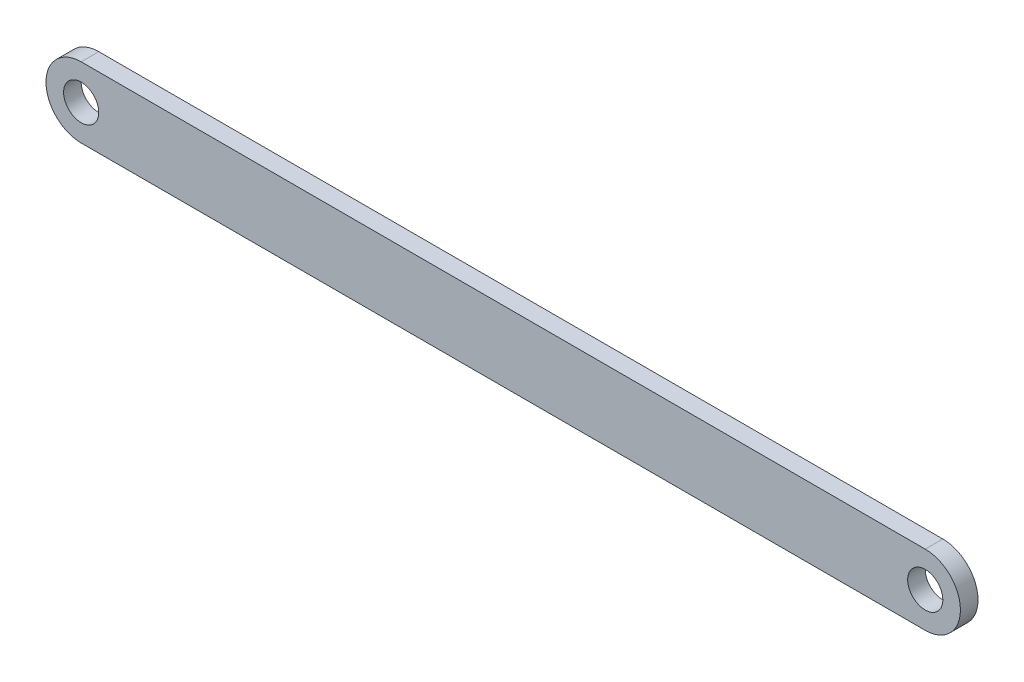
ISO-10303-21;
HEADER;
FILE_DESCRIPTION(('STEP AP214'),'2;1');
FILE_NAME('part.step','',(''),(''),'','','');
FILE_SCHEMA(('AUTOMOTIVE_DESIGN { 1 0 10303 214 1 1 1 1 }'));
ENDSEC;
DATA;
#1=APPLICATION_CONTEXT('core data for automotive mechanical design processes');
#2=APPLICATION_PROTOCOL_DEFINITION('international standard','automotive_design',2000,#1);
#3=PRODUCT_CONTEXT('',#1,'mechanical');
#4=PRODUCT('Part','Part','',(#3));
#5=PRODUCT_RELATED_PRODUCT_CATEGORY('part','',(#4));
#6=PRODUCT_DEFINITION_FORMATION('','',#4);
#7=PRODUCT_DEFINITION_CONTEXT('part definition',#1,'design');
#8=PRODUCT_DEFINITION('design','',#6,#7);
#9=PRODUCT_DEFINITION_SHAPE('','',#8);
#10=(LENGTH_UNIT() NAMED_UNIT(*) SI_UNIT(.MILLI.,.METRE.));
#11=(NAMED_UNIT(*) PLANE_ANGLE_UNIT() SI_UNIT($,.RADIAN.));
#12=(NAMED_UNIT(*) SI_UNIT($,.STERADIAN.) SOLID_ANGLE_UNIT());
#13=UNCERTAINTY_MEASURE_WITH_UNIT(LENGTH_MEASURE(1.E-05),#10,'distance_accuracy_value','');
#14=(GEOMETRIC_REPRESENTATION_CONTEXT(3) GLOBAL_UNCERTAINTY_ASSIGNED_CONTEXT((#13)) GLOBAL_UNIT_ASSIGNED_CONTEXT((#10,
#11,#12)) REPRESENTATION_CONTEXT('',''));
#15=CARTESIAN_POINT('',(0.,0.,0.));
#16=DIRECTION('',(0.,0.,1.));
#17=DIRECTION('',(1.,0.,0.));
#18=AXIS2_PLACEMENT_3D('',#15,#16,#17);
#19=CARTESIAN_POINT('',(-762.,0.157439451623581,15.875));
#20=DIRECTION('',(0.,0.,1.));
#21=DIRECTION('',(1.,0.,0.));
#22=AXIS2_PLACEMENT_3D('',#19,#20,#21);
#23=PLANE('',#22);
#24=CARTESIAN_POINT('',(-762.,0.157439451623581,15.875));
#25=DIRECTION('',(0.,0.,1.));
#26=DIRECTION('',(1.,0.,0.));
#27=AXIS2_PLACEMENT_3D('',#24,#25,#26);
#28=CIRCLE('',#27,31.75);
#29=CARTESIAN_POINT('',(-730.25,0.157439451623581,15.875));
#30=VERTEX_POINT('',#29);
#31=EDGE_CURVE('E104',#30,#30,#28,.T.);
#32=ORIENTED_EDGE('',*,*,#31,.F.);
#33=EDGE_LOOP('',(#32));
#34=FACE_BOUND('',#33,.T.);
#35=CARTESIAN_POINT('',(-762.,0.157439451623581,15.875));
#36=DIRECTION('',(0.,0.,1.));
#37=DIRECTION('',(1.,0.,0.));
#38=AXIS2_PLACEMENT_3D('',#35,#36,#37);
#39=CIRCLE('',#38,63.5);
#40=CARTESIAN_POINT('',(-762.,63.6574394516236,15.875));
#41=VERTEX_POINT('',#40);
#42=CARTESIAN_POINT('',(-762.,-63.3425605483764,15.875));
#43=VERTEX_POINT('',#42);
#44=EDGE_CURVE('E89',#41,#43,#39,.T.);
#45=ORIENTED_EDGE('',*,*,#44,.T.);
#46=DIRECTION('',(1.,0.,0.));
#47=VECTOR('',#46,1.);
#48=CARTESIAN_POINT('',(-762.,-63.3425605483764,15.875));
#49=LINE('',#48,#47);
#50=CARTESIAN_POINT('',(762.,-63.3425605483764,15.875));
#51=VERTEX_POINT('',#50);
#52=EDGE_CURVE('E84',#43,#51,#49,.T.);
#53=ORIENTED_EDGE('',*,*,#52,.T.);
#54=CARTESIAN_POINT('',(762.,0.157439451623581,15.875));
#55=DIRECTION('',(0.,0.,1.));
#56=DIRECTION('',(1.,0.,0.));
#57=AXIS2_PLACEMENT_3D('',#54,#55,#56);
#58=CIRCLE('',#57,63.5);
#59=CARTESIAN_POINT('',(762.,63.6574394516236,15.875));
#60=VERTEX_POINT('',#59);
#61=EDGE_CURVE('E87',#51,#60,#58,.T.);
#62=ORIENTED_EDGE('',*,*,#61,.T.);
#63=DIRECTION('',(-1.,0.,0.));
#64=VECTOR('',#63,1.);
#65=CARTESIAN_POINT('',(-762.,63.6574394516236,15.875));
#66=LINE('',#65,#64);
#67=EDGE_CURVE('E54',#60,#41,#66,.T.);
#68=ORIENTED_EDGE('',*,*,#67,.T.);
#69=EDGE_LOOP('',(#45,#53,#62,#68));
#70=FACE_BOUND('',#69,.T.);
#71=CARTESIAN_POINT('',(762.,0.157439451623581,15.875));
#72=DIRECTION('',(0.,0.,1.));
#73=DIRECTION('',(1.,0.,0.));
#74=AXIS2_PLACEMENT_3D('',#71,#72,#73);
#75=CIRCLE('',#74,31.75);
#76=CARTESIAN_POINT('',(793.75,0.157439451623581,15.875));
#77=VERTEX_POINT('',#76);
#78=EDGE_CURVE('E119',#77,#77,#75,.T.);
#79=ORIENTED_EDGE('',*,*,#78,.F.);
#80=EDGE_LOOP('',(#79));
#81=FACE_BOUND('',#80,.T.);
#82=ADVANCED_FACE('F37',(#34,#70,#81),#23,.T.);
#83=CARTESIAN_POINT('',(-762.,0.157439451623581,-15.875));
#84=DIRECTION('',(0.,0.,1.));
#85=DIRECTION('',(1.,0.,0.));
#86=AXIS2_PLACEMENT_3D('',#83,#84,#85);
#87=PLANE('',#86);
#88=CARTESIAN_POINT('',(-762.,0.157439451623581,-15.875));
#89=DIRECTION('',(0.,0.,1.));
#90=DIRECTION('',(1.,0.,0.));
#91=AXIS2_PLACEMENT_3D('',#88,#89,#90);
#92=CIRCLE('',#91,31.75);
#93=CARTESIAN_POINT('',(-730.25,0.157439451623581,-15.875));
#94=VERTEX_POINT('',#93);
#95=EDGE_CURVE('E116',#94,#94,#92,.T.);
#96=ORIENTED_EDGE('',*,*,#95,.T.);
#97=EDGE_LOOP('',(#96));
#98=FACE_BOUND('',#97,.T.);
#99=CARTESIAN_POINT('',(-762.,0.157439451623581,-15.875));
#100=DIRECTION('',(0.,0.,1.));
#101=DIRECTION('',(1.,0.,0.));
#102=AXIS2_PLACEMENT_3D('',#99,#100,#101);
#103=CIRCLE('',#102,63.5);
#104=CARTESIAN_POINT('',(-762.,63.6574394516236,-15.875));
#105=VERTEX_POINT('',#104);
#106=CARTESIAN_POINT('',(-762.,-63.3425605483764,-15.875));
#107=VERTEX_POINT('',#106);
#108=EDGE_CURVE('E101',#105,#107,#103,.T.);
#109=ORIENTED_EDGE('',*,*,#108,.F.);
#110=DIRECTION('',(-1.,0.,0.));
#111=VECTOR('',#110,1.);
#112=CARTESIAN_POINT('',(-762.,63.6574394516236,-15.875));
#113=LINE('',#112,#111);
#114=CARTESIAN_POINT('',(762.,63.6574394516236,-15.875));
#115=VERTEX_POINT('',#114);
#116=EDGE_CURVE('E77',#115,#105,#113,.T.);
#117=ORIENTED_EDGE('',*,*,#116,.F.);
#118=CARTESIAN_POINT('',(762.,0.157439451623581,-15.875));
#119=DIRECTION('',(0.,0.,1.));
#120=DIRECTION('',(1.,0.,0.));
#121=AXIS2_PLACEMENT_3D('',#118,#119,#120);
#122=CIRCLE('',#121,63.5);
#123=CARTESIAN_POINT('',(762.,-63.3425605483764,-15.875));
#124=VERTEX_POINT('',#123);
#125=EDGE_CURVE('E71',#124,#115,#122,.T.);
#126=ORIENTED_EDGE('',*,*,#125,.F.);
#127=DIRECTION('',(1.,0.,0.));
#128=VECTOR('',#127,1.);
#129=CARTESIAN_POINT('',(-762.,-63.3425605483764,-15.875));
#130=LINE('',#129,#128);
#131=EDGE_CURVE('E93',#107,#124,#130,.T.);
#132=ORIENTED_EDGE('',*,*,#131,.F.);
#133=EDGE_LOOP('',(#109,#117,#126,#132));
#134=FACE_BOUND('',#133,.T.);
#135=CARTESIAN_POINT('',(762.,0.157439451623581,-15.875));
#136=DIRECTION('',(0.,0.,1.));
#137=DIRECTION('',(1.,0.,0.));
#138=AXIS2_PLACEMENT_3D('',#135,#136,#137);
#139=CIRCLE('',#138,31.75);
#140=CARTESIAN_POINT('',(793.75,0.157439451623581,-15.875));
#141=VERTEX_POINT('',#140);
#142=EDGE_CURVE('E122',#141,#141,#139,.T.);
#143=ORIENTED_EDGE('',*,*,#142,.T.);
#144=EDGE_LOOP('',(#143));
#145=FACE_BOUND('',#144,.T.);
#146=ADVANCED_FACE('F112',(#98,#134,#145),#87,.F.);
#147=CARTESIAN_POINT('',(-762.,0.157439451623581,15.875));
#148=DIRECTION('',(0.,0.,-1.));
#149=DIRECTION('',(-1.,0.,0.));
#150=AXIS2_PLACEMENT_3D('',#147,#148,#149);
#151=CYLINDRICAL_SURFACE('',#150,63.5);
#152=ORIENTED_EDGE('',*,*,#108,.T.);
#153=DIRECTION('',(0.,0.,-1.));
#154=VECTOR('',#153,1.);
#155=CARTESIAN_POINT('',(-762.,-63.3425605483764,15.875));
#156=LINE('',#155,#154);
#157=EDGE_CURVE('E11',#43,#107,#156,.T.);
#158=ORIENTED_EDGE('',*,*,#157,.F.);
#159=ORIENTED_EDGE('',*,*,#44,.F.);
#160=DIRECTION('',(0.,0.,-1.));
#161=VECTOR('',#160,1.);
#162=CARTESIAN_POINT('',(-762.,63.6574394516236,15.875));
#163=LINE('',#162,#161);
#164=EDGE_CURVE('E97',#41,#105,#163,.T.);
#165=ORIENTED_EDGE('',*,*,#164,.T.);
#166=EDGE_LOOP('',(#152,#158,#159,#165));
#167=FACE_BOUND('',#166,.T.);
#168=ADVANCED_FACE('F39',(#167),#151,.T.);
#169=CARTESIAN_POINT('',(-762.,-63.3425605483764,15.875));
#170=DIRECTION('',(0.,1.,0.));
#171=DIRECTION('',(0.,0.,1.));
#172=AXIS2_PLACEMENT_3D('',#169,#170,#171);
#173=PLANE('',#172);
#174=ORIENTED_EDGE('',*,*,#131,.T.);
#175=DIRECTION('',(0.,0.,-1.));
#176=VECTOR('',#175,1.);
#177=CARTESIAN_POINT('',(762.,-63.3425605483764,15.875));
#178=LINE('',#177,#176);
#179=EDGE_CURVE('E46',#51,#124,#178,.T.);
#180=ORIENTED_EDGE('',*,*,#179,.F.);
#181=ORIENTED_EDGE('',*,*,#52,.F.);
#182=ORIENTED_EDGE('',*,*,#157,.T.);
#183=EDGE_LOOP('',(#174,#180,#181,#182));
#184=FACE_BOUND('',#183,.T.);
#185=ADVANCED_FACE('F92',(#184),#173,.F.);
#186=CARTESIAN_POINT('',(762.,0.157439451623581,15.875));
#187=DIRECTION('',(0.,0.,-1.));
#188=DIRECTION('',(-1.,0.,0.));
#189=AXIS2_PLACEMENT_3D('',#186,#187,#188);
#190=CYLINDRICAL_SURFACE('',#189,63.5);
#191=ORIENTED_EDGE('',*,*,#125,.T.);
#192=DIRECTION('',(0.,0.,-1.));
#193=VECTOR('',#192,1.);
#194=CARTESIAN_POINT('',(762.,63.6574394516236,15.875));
#195=LINE('',#194,#193);
#196=EDGE_CURVE('E94',#60,#115,#195,.T.);
#197=ORIENTED_EDGE('',*,*,#196,.F.);
#198=ORIENTED_EDGE('',*,*,#61,.F.);
#199=ORIENTED_EDGE('',*,*,#179,.T.);
#200=EDGE_LOOP('',(#191,#197,#198,#199));
#201=FACE_BOUND('',#200,.T.);
#202=ADVANCED_FACE('F95',(#201),#190,.T.);
#203=CARTESIAN_POINT('',(-762.,63.6574394516236,15.875));
#204=DIRECTION('',(0.,-1.,0.));
#205=DIRECTION('',(0.,0.,-1.));
#206=AXIS2_PLACEMENT_3D('',#203,#204,#205);
#207=PLANE('',#206);
#208=ORIENTED_EDGE('',*,*,#116,.T.);
#209=ORIENTED_EDGE('',*,*,#164,.F.);
#210=ORIENTED_EDGE('',*,*,#67,.F.);
#211=ORIENTED_EDGE('',*,*,#196,.T.);
#212=EDGE_LOOP('',(#208,#209,#210,#211));
#213=FACE_BOUND('',#212,.T.);
#214=ADVANCED_FACE('F109',(#213),#207,.F.);
#215=CARTESIAN_POINT('',(-762.,0.157439451623581,15.875));
#216=DIRECTION('',(0.,0.,-1.));
#217=DIRECTION('',(-1.,0.,0.));
#218=AXIS2_PLACEMENT_3D('',#215,#216,#217);
#219=CYLINDRICAL_SURFACE('',#218,31.75);
#220=ORIENTED_EDGE('',*,*,#31,.T.);
#221=EDGE_LOOP('',(#220));
#222=FACE_BOUND('',#221,.T.);
#223=ORIENTED_EDGE('',*,*,#95,.F.);
#224=EDGE_LOOP('',(#223));
#225=FACE_BOUND('',#224,.T.);
#226=ADVANCED_FACE('F140',(#222,#225),#219,.F.);
#227=CARTESIAN_POINT('',(762.,0.157439451623581,15.875));
#228=DIRECTION('',(0.,0.,-1.));
#229=DIRECTION('',(-1.,0.,0.));
#230=AXIS2_PLACEMENT_3D('',#227,#228,#229);
#231=CYLINDRICAL_SURFACE('',#230,31.75);
#232=ORIENTED_EDGE('',*,*,#78,.T.);
#233=EDGE_LOOP('',(#232));
#234=FACE_BOUND('',#233,.T.);
#235=ORIENTED_EDGE('',*,*,#142,.F.);
#236=EDGE_LOOP('',(#235));
#237=FACE_BOUND('',#236,.T.);
#238=ADVANCED_FACE('F128',(#234,#237),#231,.F.);
#239=CLOSED_SHELL('',(#82,#146,#168,#185,#202,#214,#226,#238));
#240=MANIFOLD_SOLID_BREP('B2',#239);
#241=ADVANCED_BREP_SHAPE_REPRESENTATION('',(#18,#240),#14);
#242=SHAPE_DEFINITION_REPRESENTATION(#9,#241);
ENDSEC;
END-ISO-10303-21;
